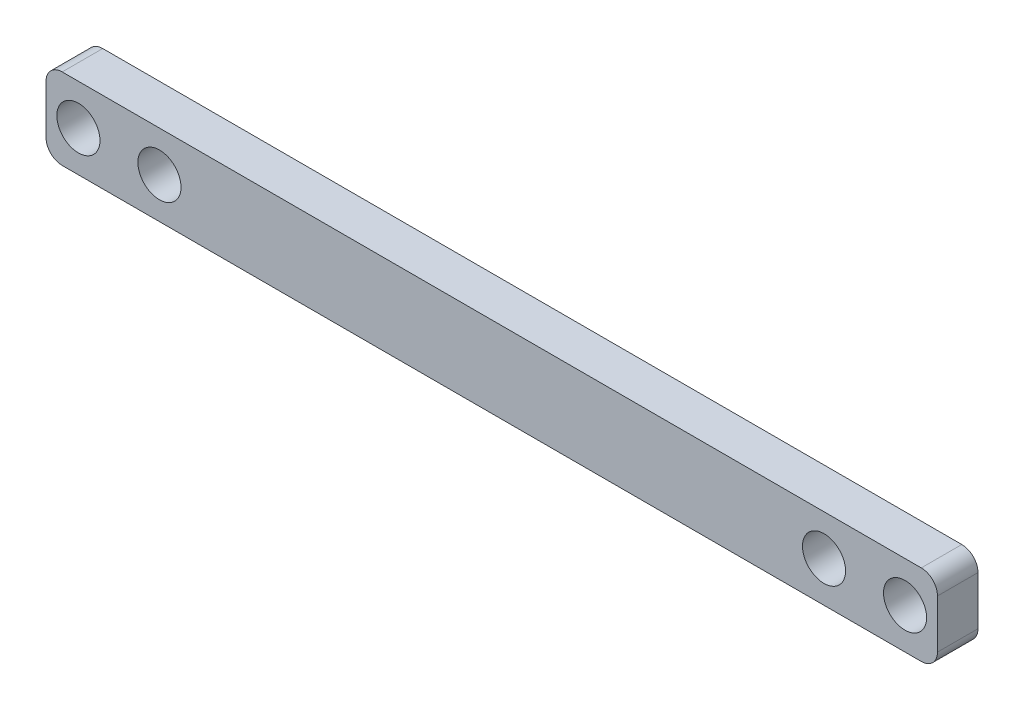
ISO-10303-21;
HEADER;
FILE_DESCRIPTION(('STEP AP214'),'2;1');
FILE_NAME('part.step','',(''),(''),'','','');
FILE_SCHEMA(('AUTOMOTIVE_DESIGN { 1 0 10303 214 1 1 1 1 }'));
ENDSEC;
DATA;
#1=APPLICATION_CONTEXT('core data for automotive mechanical design processes');
#2=APPLICATION_PROTOCOL_DEFINITION('international standard','automotive_design',2000,#1);
#3=PRODUCT_CONTEXT('',#1,'mechanical');
#4=PRODUCT('Part','Part','',(#3));
#5=PRODUCT_RELATED_PRODUCT_CATEGORY('part','',(#4));
#6=PRODUCT_DEFINITION_FORMATION('','',#4);
#7=PRODUCT_DEFINITION_CONTEXT('part definition',#1,'design');
#8=PRODUCT_DEFINITION('design','',#6,#7);
#9=PRODUCT_DEFINITION_SHAPE('','',#8);
#10=(LENGTH_UNIT() NAMED_UNIT(*) SI_UNIT(.MILLI.,.METRE.));
#11=(NAMED_UNIT(*) PLANE_ANGLE_UNIT() SI_UNIT($,.RADIAN.));
#12=(NAMED_UNIT(*) SI_UNIT($,.STERADIAN.) SOLID_ANGLE_UNIT());
#13=UNCERTAINTY_MEASURE_WITH_UNIT(LENGTH_MEASURE(1.E-05),#10,'distance_accuracy_value','');
#14=(GEOMETRIC_REPRESENTATION_CONTEXT(3) GLOBAL_UNCERTAINTY_ASSIGNED_CONTEXT((#13)) GLOBAL_UNIT_ASSIGNED_CONTEXT((#10,
#11,#12)) REPRESENTATION_CONTEXT('',''));
#15=CARTESIAN_POINT('',(0.,0.,0.));
#16=DIRECTION('',(0.,0.,1.));
#17=DIRECTION('',(1.,0.,0.));
#18=AXIS2_PLACEMENT_3D('',#15,#16,#17);
#19=CARTESIAN_POINT('',(69.85,-6.35,6.35));
#20=DIRECTION('',(-1.,0.,0.));
#21=DIRECTION('',(0.,0.,1.));
#22=AXIS2_PLACEMENT_3D('',#19,#20,#21);
#23=PLANE('',#22);
#24=DIRECTION('',(0.,1.,0.));
#25=VECTOR('',#24,1.);
#26=CARTESIAN_POINT('',(69.85,-6.35,0.));
#27=LINE('',#26,#25);
#28=CARTESIAN_POINT('',(69.85,-3.81,0.));
#29=VERTEX_POINT('',#28);
#30=CARTESIAN_POINT('',(69.85,3.81,0.));
#31=VERTEX_POINT('',#30);
#32=EDGE_CURVE('E126',#29,#31,#27,.T.);
#33=ORIENTED_EDGE('',*,*,#32,.T.);
#34=DIRECTION('',(0.,0.,-1.));
#35=VECTOR('',#34,1.);
#36=CARTESIAN_POINT('',(69.85,3.81,6.35));
#37=LINE('',#36,#35);
#38=CARTESIAN_POINT('',(69.85,3.81,6.35));
#39=VERTEX_POINT('',#38);
#40=EDGE_CURVE('E104',#31,#39,#37,.F.);
#41=ORIENTED_EDGE('',*,*,#40,.T.);
#42=DIRECTION('',(0.,1.,0.));
#43=VECTOR('',#42,1.);
#44=CARTESIAN_POINT('',(69.85,-6.35,6.35));
#45=LINE('',#44,#43);
#46=CARTESIAN_POINT('',(69.85,-3.81,6.35));
#47=VERTEX_POINT('',#46);
#48=EDGE_CURVE('E136',#47,#39,#45,.T.);
#49=ORIENTED_EDGE('',*,*,#48,.F.);
#50=DIRECTION('',(0.,0.,-1.));
#51=VECTOR('',#50,1.);
#52=CARTESIAN_POINT('',(69.85,-3.81,6.35));
#53=LINE('',#52,#51);
#54=EDGE_CURVE('E109',#47,#29,#53,.T.);
#55=ORIENTED_EDGE('',*,*,#54,.T.);
#56=EDGE_LOOP('',(#33,#41,#49,#55));
#57=FACE_BOUND('',#56,.T.);
#58=ADVANCED_FACE('F33',(#57),#23,.F.);
#59=CARTESIAN_POINT('',(-69.85,6.35,6.35));
#60=DIRECTION('',(0.,-1.,0.));
#61=DIRECTION('',(0.,0.,-1.));
#62=AXIS2_PLACEMENT_3D('',#59,#60,#61);
#63=PLANE('',#62);
#64=DIRECTION('',(-1.,0.,0.));
#65=VECTOR('',#64,1.);
#66=CARTESIAN_POINT('',(-69.85,6.35,6.35));
#67=LINE('',#66,#65);
#68=CARTESIAN_POINT('',(67.31,6.35,6.35));
#69=VERTEX_POINT('',#68);
#70=CARTESIAN_POINT('',(-67.31,6.35,6.35));
#71=VERTEX_POINT('',#70);
#72=EDGE_CURVE('E119',#69,#71,#67,.T.);
#73=ORIENTED_EDGE('',*,*,#72,.F.);
#74=DIRECTION('',(0.,0.,-1.));
#75=VECTOR('',#74,1.);
#76=CARTESIAN_POINT('',(67.31,6.35,6.35));
#77=LINE('',#76,#75);
#78=CARTESIAN_POINT('',(67.31,6.35,0.));
#79=VERTEX_POINT('',#78);
#80=EDGE_CURVE('E103',#69,#79,#77,.T.);
#81=ORIENTED_EDGE('',*,*,#80,.T.);
#82=DIRECTION('',(-1.,0.,0.));
#83=VECTOR('',#82,1.);
#84=CARTESIAN_POINT('',(-69.85,6.35,0.));
#85=LINE('',#84,#83);
#86=CARTESIAN_POINT('',(-67.31,6.35,0.));
#87=VERTEX_POINT('',#86);
#88=EDGE_CURVE('E116',#79,#87,#85,.T.);
#89=ORIENTED_EDGE('',*,*,#88,.T.);
#90=DIRECTION('',(0.,0.,-1.));
#91=VECTOR('',#90,1.);
#92=CARTESIAN_POINT('',(-67.31,6.35,6.35));
#93=LINE('',#92,#91);
#94=EDGE_CURVE('E121',#87,#71,#93,.F.);
#95=ORIENTED_EDGE('',*,*,#94,.T.);
#96=EDGE_LOOP('',(#73,#81,#89,#95));
#97=FACE_BOUND('',#96,.T.);
#98=ADVANCED_FACE('F115',(#97),#63,.F.);
#99=CARTESIAN_POINT('',(-69.85,-6.35,6.35));
#100=DIRECTION('',(1.,0.,0.));
#101=DIRECTION('',(0.,0.,-1.));
#102=AXIS2_PLACEMENT_3D('',#99,#100,#101);
#103=PLANE('',#102);
#104=DIRECTION('',(0.,-1.,0.));
#105=VECTOR('',#104,1.);
#106=CARTESIAN_POINT('',(-69.85,-6.35,0.));
#107=LINE('',#106,#105);
#108=CARTESIAN_POINT('',(-69.85,3.81,0.));
#109=VERTEX_POINT('',#108);
#110=CARTESIAN_POINT('',(-69.85,-3.81,0.));
#111=VERTEX_POINT('',#110);
#112=EDGE_CURVE('E125',#109,#111,#107,.T.);
#113=ORIENTED_EDGE('',*,*,#112,.T.);
#114=DIRECTION('',(0.,0.,-1.));
#115=VECTOR('',#114,1.);
#116=CARTESIAN_POINT('',(-69.85,-3.81,6.35));
#117=LINE('',#116,#115);
#118=CARTESIAN_POINT('',(-69.85,-3.81,6.35));
#119=VERTEX_POINT('',#118);
#120=EDGE_CURVE('E11',#111,#119,#117,.F.);
#121=ORIENTED_EDGE('',*,*,#120,.T.);
#122=DIRECTION('',(0.,-1.,0.));
#123=VECTOR('',#122,1.);
#124=CARTESIAN_POINT('',(-69.85,-6.35,6.35));
#125=LINE('',#124,#123);
#126=CARTESIAN_POINT('',(-69.85,3.81,6.35));
#127=VERTEX_POINT('',#126);
#128=EDGE_CURVE('E162',#127,#119,#125,.T.);
#129=ORIENTED_EDGE('',*,*,#128,.F.);
#130=DIRECTION('',(0.,0.,-1.));
#131=VECTOR('',#130,1.);
#132=CARTESIAN_POINT('',(-69.85,3.81,6.35));
#133=LINE('',#132,#131);
#134=EDGE_CURVE('E41',#127,#109,#133,.T.);
#135=ORIENTED_EDGE('',*,*,#134,.T.);
#136=EDGE_LOOP('',(#113,#121,#129,#135));
#137=FACE_BOUND('',#136,.T.);
#138=ADVANCED_FACE('F160',(#137),#103,.F.);
#139=CARTESIAN_POINT('',(-69.85,-6.35,6.35));
#140=DIRECTION('',(0.,1.,0.));
#141=DIRECTION('',(0.,0.,1.));
#142=AXIS2_PLACEMENT_3D('',#139,#140,#141);
#143=PLANE('',#142);
#144=DIRECTION('',(1.,0.,0.));
#145=VECTOR('',#144,1.);
#146=CARTESIAN_POINT('',(-69.85,-6.35,0.));
#147=LINE('',#146,#145);
#148=CARTESIAN_POINT('',(-67.31,-6.35,0.));
#149=VERTEX_POINT('',#148);
#150=CARTESIAN_POINT('',(67.31,-6.35,0.));
#151=VERTEX_POINT('',#150);
#152=EDGE_CURVE('E129',#149,#151,#147,.T.);
#153=ORIENTED_EDGE('',*,*,#152,.T.);
#154=DIRECTION('',(0.,0.,-1.));
#155=VECTOR('',#154,1.);
#156=CARTESIAN_POINT('',(67.31,-6.35,6.35));
#157=LINE('',#156,#155);
#158=CARTESIAN_POINT('',(67.31,-6.35,6.35));
#159=VERTEX_POINT('',#158);
#160=EDGE_CURVE('E48',#151,#159,#157,.F.);
#161=ORIENTED_EDGE('',*,*,#160,.T.);
#162=DIRECTION('',(1.,0.,0.));
#163=VECTOR('',#162,1.);
#164=CARTESIAN_POINT('',(-69.85,-6.35,6.35));
#165=LINE('',#164,#163);
#166=CARTESIAN_POINT('',(-67.31,-6.35,6.35));
#167=VERTEX_POINT('',#166);
#168=EDGE_CURVE('E137',#167,#159,#165,.T.);
#169=ORIENTED_EDGE('',*,*,#168,.F.);
#170=DIRECTION('',(0.,0.,-1.));
#171=VECTOR('',#170,1.);
#172=CARTESIAN_POINT('',(-67.31,-6.35,6.35));
#173=LINE('',#172,#171);
#174=EDGE_CURVE('E153',#167,#149,#173,.T.);
#175=ORIENTED_EDGE('',*,*,#174,.T.);
#176=EDGE_LOOP('',(#153,#161,#169,#175));
#177=FACE_BOUND('',#176,.T.);
#178=ADVANCED_FACE('F169',(#177),#143,.F.);
#179=CARTESIAN_POINT('',(69.85,6.35,6.35));
#180=DIRECTION('',(0.,0.,-1.));
#181=DIRECTION('',(-1.,0.,0.));
#182=AXIS2_PLACEMENT_3D('',#179,#180,#181);
#183=PLANE('',#182);
#184=CARTESIAN_POINT('',(-64.77,0.,6.35));
#185=DIRECTION('',(0.,0.,1.));
#186=DIRECTION('',(1.,0.,0.));
#187=AXIS2_PLACEMENT_3D('',#184,#185,#186);
#188=CIRCLE('',#187,3.37819999999998);
#189=CARTESIAN_POINT('',(-61.3918,0.,6.35));
#190=VERTEX_POINT('',#189);
#191=EDGE_CURVE('E196',#190,#190,#188,.T.);
#192=ORIENTED_EDGE('',*,*,#191,.F.);
#193=EDGE_LOOP('',(#192));
#194=FACE_BOUND('',#193,.T.);
#195=CARTESIAN_POINT('',(-52.07,0.,6.35));
#196=DIRECTION('',(0.,0.,1.));
#197=DIRECTION('',(1.,0.,0.));
#198=AXIS2_PLACEMENT_3D('',#195,#196,#197);
#199=CIRCLE('',#198,3.37819999999998);
#200=CARTESIAN_POINT('',(-48.6918,0.,6.35));
#201=VERTEX_POINT('',#200);
#202=EDGE_CURVE('E190',#201,#201,#199,.T.);
#203=ORIENTED_EDGE('',*,*,#202,.F.);
#204=EDGE_LOOP('',(#203));
#205=FACE_BOUND('',#204,.T.);
#206=CARTESIAN_POINT('',(52.07,0.,6.35));
#207=DIRECTION('',(0.,0.,1.));
#208=DIRECTION('',(1.,0.,0.));
#209=AXIS2_PLACEMENT_3D('',#206,#207,#208);
#210=CIRCLE('',#209,3.37819999999998);
#211=CARTESIAN_POINT('',(55.4482,0.,6.35));
#212=VERTEX_POINT('',#211);
#213=EDGE_CURVE('E184',#212,#212,#210,.T.);
#214=ORIENTED_EDGE('',*,*,#213,.F.);
#215=EDGE_LOOP('',(#214));
#216=FACE_BOUND('',#215,.T.);
#217=CARTESIAN_POINT('',(64.77,0.,6.35));
#218=DIRECTION('',(0.,0.,1.));
#219=DIRECTION('',(1.,0.,0.));
#220=AXIS2_PLACEMENT_3D('',#217,#218,#219);
#221=CIRCLE('',#220,3.37819999999998);
#222=CARTESIAN_POINT('',(68.1482,0.,6.35));
#223=VERTEX_POINT('',#222);
#224=EDGE_CURVE('E178',#223,#223,#221,.T.);
#225=ORIENTED_EDGE('',*,*,#224,.F.);
#226=EDGE_LOOP('',(#225));
#227=FACE_BOUND('',#226,.T.);
#228=ORIENTED_EDGE('',*,*,#48,.T.);
#229=CARTESIAN_POINT('',(67.31,3.81,6.35));
#230=DIRECTION('',(0.,0.,-1.));
#231=DIRECTION('',(-1.,0.,0.));
#232=AXIS2_PLACEMENT_3D('',#229,#230,#231);
#233=CIRCLE('',#232,2.54);
#234=EDGE_CURVE('E151',#39,#69,#233,.F.);
#235=ORIENTED_EDGE('',*,*,#234,.T.);
#236=ORIENTED_EDGE('',*,*,#72,.T.);
#237=CARTESIAN_POINT('',(-67.31,3.81,6.35));
#238=DIRECTION('',(0.,0.,-1.));
#239=DIRECTION('',(-1.,0.,0.));
#240=AXIS2_PLACEMENT_3D('',#237,#238,#239);
#241=CIRCLE('',#240,2.54);
#242=EDGE_CURVE('E146',#71,#127,#241,.F.);
#243=ORIENTED_EDGE('',*,*,#242,.T.);
#244=ORIENTED_EDGE('',*,*,#128,.T.);
#245=CARTESIAN_POINT('',(-67.31,-3.81,6.35));
#246=DIRECTION('',(0.,0.,-1.));
#247=DIRECTION('',(-1.,0.,0.));
#248=AXIS2_PLACEMENT_3D('',#245,#246,#247);
#249=CIRCLE('',#248,2.54);
#250=EDGE_CURVE('E55',#119,#167,#249,.F.);
#251=ORIENTED_EDGE('',*,*,#250,.T.);
#252=ORIENTED_EDGE('',*,*,#168,.T.);
#253=CARTESIAN_POINT('',(67.31,-3.81,6.35));
#254=DIRECTION('',(0.,0.,-1.));
#255=DIRECTION('',(-1.,0.,0.));
#256=AXIS2_PLACEMENT_3D('',#253,#254,#255);
#257=CIRCLE('',#256,2.54);
#258=EDGE_CURVE('E149',#159,#47,#257,.F.);
#259=ORIENTED_EDGE('',*,*,#258,.T.);
#260=EDGE_LOOP('',(#228,#235,#236,#243,#244,#251,#252,#259));
#261=FACE_BOUND('',#260,.T.);
#262=ADVANCED_FACE('F202',(#194,#205,#216,#227,#261),#183,.F.);
#263=CARTESIAN_POINT('',(69.85,6.35,0.));
#264=DIRECTION('',(0.,0.,-1.));
#265=DIRECTION('',(-1.,0.,0.));
#266=AXIS2_PLACEMENT_3D('',#263,#264,#265);
#267=PLANE('',#266);
#268=CARTESIAN_POINT('',(-64.77,0.,0.));
#269=DIRECTION('',(0.,0.,1.));
#270=DIRECTION('',(1.,0.,0.));
#271=AXIS2_PLACEMENT_3D('',#268,#269,#270);
#272=CIRCLE('',#271,3.3782);
#273=CARTESIAN_POINT('',(-61.3918,0.,0.));
#274=VERTEX_POINT('',#273);
#275=EDGE_CURVE('E193',#274,#274,#272,.T.);
#276=ORIENTED_EDGE('',*,*,#275,.T.);
#277=EDGE_LOOP('',(#276));
#278=FACE_BOUND('',#277,.T.);
#279=CARTESIAN_POINT('',(-52.07,0.,0.));
#280=DIRECTION('',(0.,0.,1.));
#281=DIRECTION('',(1.,0.,0.));
#282=AXIS2_PLACEMENT_3D('',#279,#280,#281);
#283=CIRCLE('',#282,3.3782);
#284=CARTESIAN_POINT('',(-48.6918,0.,0.));
#285=VERTEX_POINT('',#284);
#286=EDGE_CURVE('E187',#285,#285,#283,.T.);
#287=ORIENTED_EDGE('',*,*,#286,.T.);
#288=EDGE_LOOP('',(#287));
#289=FACE_BOUND('',#288,.T.);
#290=CARTESIAN_POINT('',(52.07,0.,0.));
#291=DIRECTION('',(0.,0.,1.));
#292=DIRECTION('',(1.,0.,0.));
#293=AXIS2_PLACEMENT_3D('',#290,#291,#292);
#294=CIRCLE('',#293,3.3782);
#295=CARTESIAN_POINT('',(55.4482,0.,0.));
#296=VERTEX_POINT('',#295);
#297=EDGE_CURVE('E181',#296,#296,#294,.T.);
#298=ORIENTED_EDGE('',*,*,#297,.T.);
#299=EDGE_LOOP('',(#298));
#300=FACE_BOUND('',#299,.T.);
#301=CARTESIAN_POINT('',(64.77,0.,0.));
#302=DIRECTION('',(0.,0.,1.));
#303=DIRECTION('',(1.,0.,0.));
#304=AXIS2_PLACEMENT_3D('',#301,#302,#303);
#305=CIRCLE('',#304,3.3782);
#306=CARTESIAN_POINT('',(68.1482,0.,0.));
#307=VERTEX_POINT('',#306);
#308=EDGE_CURVE('E131',#307,#307,#305,.T.);
#309=ORIENTED_EDGE('',*,*,#308,.T.);
#310=EDGE_LOOP('',(#309));
#311=FACE_BOUND('',#310,.T.);
#312=ORIENTED_EDGE('',*,*,#88,.F.);
#313=CARTESIAN_POINT('',(67.31,3.81,0.));
#314=DIRECTION('',(0.,0.,-1.));
#315=DIRECTION('',(-1.,0.,0.));
#316=AXIS2_PLACEMENT_3D('',#313,#314,#315);
#317=CIRCLE('',#316,2.54);
#318=EDGE_CURVE('E99',#79,#31,#317,.T.);
#319=ORIENTED_EDGE('',*,*,#318,.T.);
#320=ORIENTED_EDGE('',*,*,#32,.F.);
#321=CARTESIAN_POINT('',(67.31,-3.81,0.));
#322=DIRECTION('',(0.,0.,-1.));
#323=DIRECTION('',(-1.,0.,0.));
#324=AXIS2_PLACEMENT_3D('',#321,#322,#323);
#325=CIRCLE('',#324,2.54);
#326=EDGE_CURVE('E110',#29,#151,#325,.T.);
#327=ORIENTED_EDGE('',*,*,#326,.T.);
#328=ORIENTED_EDGE('',*,*,#152,.F.);
#329=CARTESIAN_POINT('',(-67.31,-3.81,0.));
#330=DIRECTION('',(0.,0.,-1.));
#331=DIRECTION('',(-1.,0.,0.));
#332=AXIS2_PLACEMENT_3D('',#329,#330,#331);
#333=CIRCLE('',#332,2.54);
#334=EDGE_CURVE('E140',#149,#111,#333,.T.);
#335=ORIENTED_EDGE('',*,*,#334,.T.);
#336=ORIENTED_EDGE('',*,*,#112,.F.);
#337=CARTESIAN_POINT('',(-67.31,3.81,0.));
#338=DIRECTION('',(0.,0.,-1.));
#339=DIRECTION('',(-1.,0.,0.));
#340=AXIS2_PLACEMENT_3D('',#337,#338,#339);
#341=CIRCLE('',#340,2.54);
#342=EDGE_CURVE('E120',#109,#87,#341,.T.);
#343=ORIENTED_EDGE('',*,*,#342,.T.);
#344=EDGE_LOOP('',(#312,#319,#320,#327,#328,#335,#336,#343));
#345=FACE_BOUND('',#344,.T.);
#346=ADVANCED_FACE('F123',(#278,#289,#300,#311,#345),#267,.T.);
#347=CARTESIAN_POINT('',(64.77,0.,6.35));
#348=DIRECTION('',(0.,0.,1.));
#349=DIRECTION('',(1.,0.,0.));
#350=AXIS2_PLACEMENT_3D('',#347,#348,#349);
#351=CYLINDRICAL_SURFACE('',#350,3.37819999999999);
#352=ORIENTED_EDGE('',*,*,#308,.F.);
#353=EDGE_LOOP('',(#352));
#354=FACE_BOUND('',#353,.T.);
#355=ORIENTED_EDGE('',*,*,#224,.T.);
#356=EDGE_LOOP('',(#355));
#357=FACE_BOUND('',#356,.T.);
#358=ADVANCED_FACE('F235',(#354,#357),#351,.F.);
#359=CARTESIAN_POINT('',(52.07,0.,6.35));
#360=DIRECTION('',(0.,0.,1.));
#361=DIRECTION('',(1.,0.,0.));
#362=AXIS2_PLACEMENT_3D('',#359,#360,#361);
#363=CYLINDRICAL_SURFACE('',#362,3.37819999999999);
#364=ORIENTED_EDGE('',*,*,#297,.F.);
#365=EDGE_LOOP('',(#364));
#366=FACE_BOUND('',#365,.T.);
#367=ORIENTED_EDGE('',*,*,#213,.T.);
#368=EDGE_LOOP('',(#367));
#369=FACE_BOUND('',#368,.T.);
#370=ADVANCED_FACE('F240',(#366,#369),#363,.F.);
#371=CARTESIAN_POINT('',(-52.07,0.,6.35));
#372=DIRECTION('',(0.,0.,1.));
#373=DIRECTION('',(1.,0.,0.));
#374=AXIS2_PLACEMENT_3D('',#371,#372,#373);
#375=CYLINDRICAL_SURFACE('',#374,3.37819999999999);
#376=ORIENTED_EDGE('',*,*,#286,.F.);
#377=EDGE_LOOP('',(#376));
#378=FACE_BOUND('',#377,.T.);
#379=ORIENTED_EDGE('',*,*,#202,.T.);
#380=EDGE_LOOP('',(#379));
#381=FACE_BOUND('',#380,.T.);
#382=ADVANCED_FACE('F244',(#378,#381),#375,.F.);
#383=CARTESIAN_POINT('',(-64.77,0.,6.35));
#384=DIRECTION('',(0.,0.,1.));
#385=DIRECTION('',(1.,0.,0.));
#386=AXIS2_PLACEMENT_3D('',#383,#384,#385);
#387=CYLINDRICAL_SURFACE('',#386,3.37819999999999);
#388=ORIENTED_EDGE('',*,*,#275,.F.);
#389=EDGE_LOOP('',(#388));
#390=FACE_BOUND('',#389,.T.);
#391=ORIENTED_EDGE('',*,*,#191,.T.);
#392=EDGE_LOOP('',(#391));
#393=FACE_BOUND('',#392,.T.);
#394=ADVANCED_FACE('F200',(#390,#393),#387,.F.);
#395=CARTESIAN_POINT('',(67.31,3.81,6.35));
#396=DIRECTION('',(0.,0.,-1.));
#397=DIRECTION('',(-1.,0.,0.));
#398=AXIS2_PLACEMENT_3D('',#395,#396,#397);
#399=CYLINDRICAL_SURFACE('',#398,2.54);
#400=ORIENTED_EDGE('',*,*,#234,.F.);
#401=ORIENTED_EDGE('',*,*,#40,.F.);
#402=ORIENTED_EDGE('',*,*,#318,.F.);
#403=ORIENTED_EDGE('',*,*,#80,.F.);
#404=EDGE_LOOP('',(#400,#401,#402,#403));
#405=FACE_BOUND('',#404,.T.);
#406=ADVANCED_FACE('F102',(#405),#399,.T.);
#407=CARTESIAN_POINT('',(67.31,-3.81,6.35));
#408=DIRECTION('',(0.,0.,-1.));
#409=DIRECTION('',(-1.,0.,0.));
#410=AXIS2_PLACEMENT_3D('',#407,#408,#409);
#411=CYLINDRICAL_SURFACE('',#410,2.54);
#412=ORIENTED_EDGE('',*,*,#258,.F.);
#413=ORIENTED_EDGE('',*,*,#160,.F.);
#414=ORIENTED_EDGE('',*,*,#326,.F.);
#415=ORIENTED_EDGE('',*,*,#54,.F.);
#416=EDGE_LOOP('',(#412,#413,#414,#415));
#417=FACE_BOUND('',#416,.T.);
#418=ADVANCED_FACE('F215',(#417),#411,.T.);
#419=CARTESIAN_POINT('',(-67.31,-3.81,6.35));
#420=DIRECTION('',(0.,0.,-1.));
#421=DIRECTION('',(-1.,0.,0.));
#422=AXIS2_PLACEMENT_3D('',#419,#420,#421);
#423=CYLINDRICAL_SURFACE('',#422,2.54);
#424=ORIENTED_EDGE('',*,*,#250,.F.);
#425=ORIENTED_EDGE('',*,*,#120,.F.);
#426=ORIENTED_EDGE('',*,*,#334,.F.);
#427=ORIENTED_EDGE('',*,*,#174,.F.);
#428=EDGE_LOOP('',(#424,#425,#426,#427));
#429=FACE_BOUND('',#428,.T.);
#430=ADVANCED_FACE('F168',(#429),#423,.T.);
#431=CARTESIAN_POINT('',(-67.31,3.81,6.35));
#432=DIRECTION('',(0.,0.,-1.));
#433=DIRECTION('',(-1.,0.,0.));
#434=AXIS2_PLACEMENT_3D('',#431,#432,#433);
#435=CYLINDRICAL_SURFACE('',#434,2.54);
#436=ORIENTED_EDGE('',*,*,#242,.F.);
#437=ORIENTED_EDGE('',*,*,#94,.F.);
#438=ORIENTED_EDGE('',*,*,#342,.F.);
#439=ORIENTED_EDGE('',*,*,#134,.F.);
#440=EDGE_LOOP('',(#436,#437,#438,#439));
#441=FACE_BOUND('',#440,.T.);
#442=ADVANCED_FACE('F35',(#441),#435,.T.);
#443=CLOSED_SHELL('',(#58,#98,#138,#178,#262,#346,#358,#370,#382,#394,#406,#418,#430,#442));
#444=MANIFOLD_SOLID_BREP('B2',#443);
#445=ADVANCED_BREP_SHAPE_REPRESENTATION('',(#18,#444),#14);
#446=SHAPE_DEFINITION_REPRESENTATION(#9,#445);
ENDSEC;
END-ISO-10303-21;
